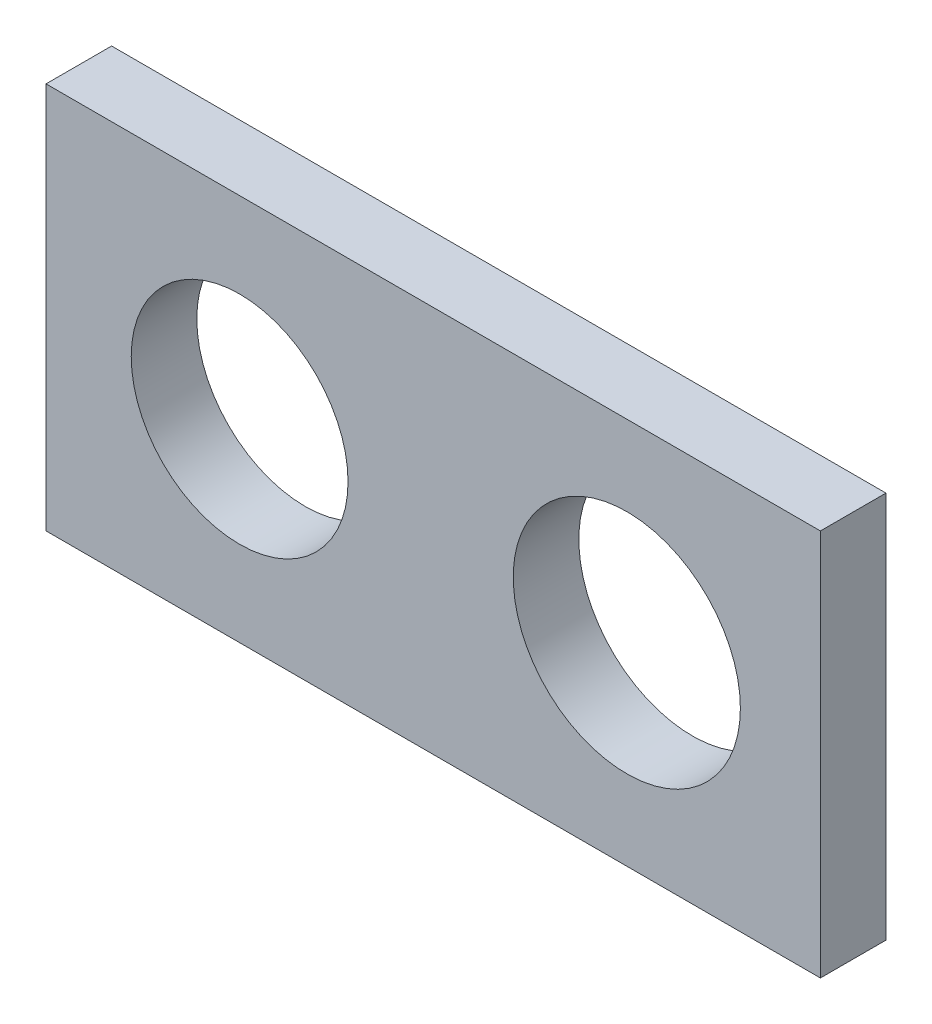
ISO-10303-21;
HEADER;
FILE_DESCRIPTION(('STEP AP214'),'2;1');
FILE_NAME('part.step','',(''),(''),'','','');
FILE_SCHEMA(('AUTOMOTIVE_DESIGN { 1 0 10303 214 1 1 1 1 }'));
ENDSEC;
DATA;
#1=APPLICATION_CONTEXT('core data for automotive mechanical design processes');
#2=APPLICATION_PROTOCOL_DEFINITION('international standard','automotive_design',2000,#1);
#3=PRODUCT_CONTEXT('',#1,'mechanical');
#4=PRODUCT('Part','Part','',(#3));
#5=PRODUCT_RELATED_PRODUCT_CATEGORY('part','',(#4));
#6=PRODUCT_DEFINITION_FORMATION('','',#4);
#7=PRODUCT_DEFINITION_CONTEXT('part definition',#1,'design');
#8=PRODUCT_DEFINITION('design','',#6,#7);
#9=PRODUCT_DEFINITION_SHAPE('','',#8);
#10=(LENGTH_UNIT() NAMED_UNIT(*) SI_UNIT(.MILLI.,.METRE.));
#11=(NAMED_UNIT(*) PLANE_ANGLE_UNIT() SI_UNIT($,.RADIAN.));
#12=(NAMED_UNIT(*) SI_UNIT($,.STERADIAN.) SOLID_ANGLE_UNIT());
#13=UNCERTAINTY_MEASURE_WITH_UNIT(LENGTH_MEASURE(1.E-05),#10,'distance_accuracy_value','');
#14=(GEOMETRIC_REPRESENTATION_CONTEXT(3) GLOBAL_UNCERTAINTY_ASSIGNED_CONTEXT((#13)) GLOBAL_UNIT_ASSIGNED_CONTEXT((#10,
#11,#12)) REPRESENTATION_CONTEXT('',''));
#15=CARTESIAN_POINT('',(0.,0.,0.));
#16=DIRECTION('',(0.,0.,1.));
#17=DIRECTION('',(1.,0.,0.));
#18=AXIS2_PLACEMENT_3D('',#15,#16,#17);
#19=CARTESIAN_POINT('',(0.,0.,2.54));
#20=DIRECTION('',(0.,0.,-1.));
#21=DIRECTION('',(-1.,0.,0.));
#22=AXIS2_PLACEMENT_3D('',#19,#20,#21);
#23=PLANE('',#22);
#24=DIRECTION('',(0.,1.,0.));
#25=VECTOR('',#24,1.);
#26=CARTESIAN_POINT('',(15.,-7.5,2.54));
#27=LINE('',#26,#25);
#28=CARTESIAN_POINT('',(15.,-7.5,2.54));
#29=VERTEX_POINT('',#28);
#30=CARTESIAN_POINT('',(15.,7.5,2.54));
#31=VERTEX_POINT('',#30);
#32=EDGE_CURVE('E91',#29,#31,#27,.T.);
#33=ORIENTED_EDGE('',*,*,#32,.T.);
#34=DIRECTION('',(-1.,0.,0.));
#35=VECTOR('',#34,1.);
#36=CARTESIAN_POINT('',(-15.,7.5,2.54));
#37=LINE('',#36,#35);
#38=CARTESIAN_POINT('',(-15.,7.5,2.54));
#39=VERTEX_POINT('',#38);
#40=EDGE_CURVE('E86',#31,#39,#37,.T.);
#41=ORIENTED_EDGE('',*,*,#40,.T.);
#42=DIRECTION('',(0.,-1.,0.));
#43=VECTOR('',#42,1.);
#44=CARTESIAN_POINT('',(-15.,-7.5,2.54));
#45=LINE('',#44,#43);
#46=CARTESIAN_POINT('',(-15.,-7.5,2.54));
#47=VERTEX_POINT('',#46);
#48=EDGE_CURVE('E89',#39,#47,#45,.T.);
#49=ORIENTED_EDGE('',*,*,#48,.T.);
#50=DIRECTION('',(1.,0.,0.));
#51=VECTOR('',#50,1.);
#52=CARTESIAN_POINT('',(-15.,-7.5,2.54));
#53=LINE('',#52,#51);
#54=EDGE_CURVE('E56',#47,#29,#53,.T.);
#55=ORIENTED_EDGE('',*,*,#54,.T.);
#56=EDGE_LOOP('',(#33,#41,#49,#55));
#57=FACE_BOUND('',#56,.T.);
#58=CARTESIAN_POINT('',(-7.5,0.,2.54));
#59=DIRECTION('',(0.,0.,1.));
#60=DIRECTION('',(1.,0.,0.));
#61=AXIS2_PLACEMENT_3D('',#58,#59,#60);
#62=CIRCLE('',#61,4.2);
#63=CARTESIAN_POINT('',(-3.3,0.,2.54));
#64=VERTEX_POINT('',#63);
#65=EDGE_CURVE('E106',#64,#64,#62,.T.);
#66=ORIENTED_EDGE('',*,*,#65,.F.);
#67=EDGE_LOOP('',(#66));
#68=FACE_BOUND('',#67,.T.);
#69=CARTESIAN_POINT('',(7.5,0.,2.54));
#70=DIRECTION('',(0.,0.,1.));
#71=DIRECTION('',(1.,0.,0.));
#72=AXIS2_PLACEMENT_3D('',#69,#70,#71);
#73=CIRCLE('',#72,4.4);
#74=CARTESIAN_POINT('',(11.9,0.,2.54));
#75=VERTEX_POINT('',#74);
#76=EDGE_CURVE('E121',#75,#75,#73,.T.);
#77=ORIENTED_EDGE('',*,*,#76,.F.);
#78=EDGE_LOOP('',(#77));
#79=FACE_BOUND('',#78,.T.);
#80=ADVANCED_FACE('F39',(#57,#68,#79),#23,.F.);
#81=CARTESIAN_POINT('',(0.,0.,0.));
#82=DIRECTION('',(0.,0.,-1.));
#83=DIRECTION('',(-1.,0.,0.));
#84=AXIS2_PLACEMENT_3D('',#81,#82,#83);
#85=PLANE('',#84);
#86=CARTESIAN_POINT('',(-7.5,0.,0.));
#87=DIRECTION('',(0.,0.,1.));
#88=DIRECTION('',(1.,0.,0.));
#89=AXIS2_PLACEMENT_3D('',#86,#87,#88);
#90=CIRCLE('',#89,4.2);
#91=CARTESIAN_POINT('',(-3.3,0.,0.));
#92=VERTEX_POINT('',#91);
#93=EDGE_CURVE('E118',#92,#92,#90,.T.);
#94=ORIENTED_EDGE('',*,*,#93,.T.);
#95=EDGE_LOOP('',(#94));
#96=FACE_BOUND('',#95,.T.);
#97=DIRECTION('',(0.,1.,0.));
#98=VECTOR('',#97,1.);
#99=CARTESIAN_POINT('',(15.,-7.5,0.));
#100=LINE('',#99,#98);
#101=CARTESIAN_POINT('',(15.,-7.5,0.));
#102=VERTEX_POINT('',#101);
#103=CARTESIAN_POINT('',(15.,7.5,0.));
#104=VERTEX_POINT('',#103);
#105=EDGE_CURVE('E103',#102,#104,#100,.T.);
#106=ORIENTED_EDGE('',*,*,#105,.F.);
#107=DIRECTION('',(1.,0.,0.));
#108=VECTOR('',#107,1.);
#109=CARTESIAN_POINT('',(-15.,-7.5,0.));
#110=LINE('',#109,#108);
#111=CARTESIAN_POINT('',(-15.,-7.5,0.));
#112=VERTEX_POINT('',#111);
#113=EDGE_CURVE('E79',#112,#102,#110,.T.);
#114=ORIENTED_EDGE('',*,*,#113,.F.);
#115=DIRECTION('',(0.,-1.,0.));
#116=VECTOR('',#115,1.);
#117=CARTESIAN_POINT('',(-15.,-7.5,0.));
#118=LINE('',#117,#116);
#119=CARTESIAN_POINT('',(-15.,7.5,0.));
#120=VERTEX_POINT('',#119);
#121=EDGE_CURVE('E73',#120,#112,#118,.T.);
#122=ORIENTED_EDGE('',*,*,#121,.F.);
#123=DIRECTION('',(-1.,0.,0.));
#124=VECTOR('',#123,1.);
#125=CARTESIAN_POINT('',(-15.,7.5,0.));
#126=LINE('',#125,#124);
#127=EDGE_CURVE('E95',#104,#120,#126,.T.);
#128=ORIENTED_EDGE('',*,*,#127,.F.);
#129=EDGE_LOOP('',(#106,#114,#122,#128));
#130=FACE_BOUND('',#129,.T.);
#131=CARTESIAN_POINT('',(7.5,0.,0.));
#132=DIRECTION('',(0.,0.,1.));
#133=DIRECTION('',(1.,0.,0.));
#134=AXIS2_PLACEMENT_3D('',#131,#132,#133);
#135=CIRCLE('',#134,4.4);
#136=CARTESIAN_POINT('',(11.9,0.,0.));
#137=VERTEX_POINT('',#136);
#138=EDGE_CURVE('E124',#137,#137,#135,.T.);
#139=ORIENTED_EDGE('',*,*,#138,.T.);
#140=EDGE_LOOP('',(#139));
#141=FACE_BOUND('',#140,.T.);
#142=ADVANCED_FACE('F114',(#96,#130,#141),#85,.T.);
#143=CARTESIAN_POINT('',(15.,-7.5,2.54));
#144=DIRECTION('',(-1.,0.,0.));
#145=DIRECTION('',(0.,0.,1.));
#146=AXIS2_PLACEMENT_3D('',#143,#144,#145);
#147=PLANE('',#146);
#148=ORIENTED_EDGE('',*,*,#105,.T.);
#149=DIRECTION('',(0.,0.,-1.));
#150=VECTOR('',#149,1.);
#151=CARTESIAN_POINT('',(15.,7.5,2.54));
#152=LINE('',#151,#150);
#153=EDGE_CURVE('E11',#31,#104,#152,.T.);
#154=ORIENTED_EDGE('',*,*,#153,.F.);
#155=ORIENTED_EDGE('',*,*,#32,.F.);
#156=DIRECTION('',(0.,0.,-1.));
#157=VECTOR('',#156,1.);
#158=CARTESIAN_POINT('',(15.,-7.5,2.54));
#159=LINE('',#158,#157);
#160=EDGE_CURVE('E99',#29,#102,#159,.T.);
#161=ORIENTED_EDGE('',*,*,#160,.T.);
#162=EDGE_LOOP('',(#148,#154,#155,#161));
#163=FACE_BOUND('',#162,.T.);
#164=ADVANCED_FACE('F41',(#163),#147,.F.);
#165=CARTESIAN_POINT('',(-15.,7.5,2.54));
#166=DIRECTION('',(0.,-1.,0.));
#167=DIRECTION('',(0.,0.,-1.));
#168=AXIS2_PLACEMENT_3D('',#165,#166,#167);
#169=PLANE('',#168);
#170=ORIENTED_EDGE('',*,*,#127,.T.);
#171=DIRECTION('',(0.,0.,-1.));
#172=VECTOR('',#171,1.);
#173=CARTESIAN_POINT('',(-15.,7.5,2.54));
#174=LINE('',#173,#172);
#175=EDGE_CURVE('E48',#39,#120,#174,.T.);
#176=ORIENTED_EDGE('',*,*,#175,.F.);
#177=ORIENTED_EDGE('',*,*,#40,.F.);
#178=ORIENTED_EDGE('',*,*,#153,.T.);
#179=EDGE_LOOP('',(#170,#176,#177,#178));
#180=FACE_BOUND('',#179,.T.);
#181=ADVANCED_FACE('F94',(#180),#169,.F.);
#182=CARTESIAN_POINT('',(-15.,-7.5,2.54));
#183=DIRECTION('',(1.,0.,0.));
#184=DIRECTION('',(0.,0.,-1.));
#185=AXIS2_PLACEMENT_3D('',#182,#183,#184);
#186=PLANE('',#185);
#187=ORIENTED_EDGE('',*,*,#121,.T.);
#188=DIRECTION('',(0.,0.,-1.));
#189=VECTOR('',#188,1.);
#190=CARTESIAN_POINT('',(-15.,-7.5,2.54));
#191=LINE('',#190,#189);
#192=EDGE_CURVE('E96',#47,#112,#191,.T.);
#193=ORIENTED_EDGE('',*,*,#192,.F.);
#194=ORIENTED_EDGE('',*,*,#48,.F.);
#195=ORIENTED_EDGE('',*,*,#175,.T.);
#196=EDGE_LOOP('',(#187,#193,#194,#195));
#197=FACE_BOUND('',#196,.T.);
#198=ADVANCED_FACE('F97',(#197),#186,.F.);
#199=CARTESIAN_POINT('',(-15.,-7.5,2.54));
#200=DIRECTION('',(0.,1.,0.));
#201=DIRECTION('',(0.,0.,1.));
#202=AXIS2_PLACEMENT_3D('',#199,#200,#201);
#203=PLANE('',#202);
#204=ORIENTED_EDGE('',*,*,#113,.T.);
#205=ORIENTED_EDGE('',*,*,#160,.F.);
#206=ORIENTED_EDGE('',*,*,#54,.F.);
#207=ORIENTED_EDGE('',*,*,#192,.T.);
#208=EDGE_LOOP('',(#204,#205,#206,#207));
#209=FACE_BOUND('',#208,.T.);
#210=ADVANCED_FACE('F111',(#209),#203,.F.);
#211=CARTESIAN_POINT('',(-7.5,0.,2.54));
#212=DIRECTION('',(0.,0.,-1.));
#213=DIRECTION('',(-1.,0.,0.));
#214=AXIS2_PLACEMENT_3D('',#211,#212,#213);
#215=CYLINDRICAL_SURFACE('',#214,4.2);
#216=ORIENTED_EDGE('',*,*,#65,.T.);
#217=EDGE_LOOP('',(#216));
#218=FACE_BOUND('',#217,.T.);
#219=ORIENTED_EDGE('',*,*,#93,.F.);
#220=EDGE_LOOP('',(#219));
#221=FACE_BOUND('',#220,.T.);
#222=ADVANCED_FACE('F141',(#218,#221),#215,.F.);
#223=CARTESIAN_POINT('',(7.5,0.,2.54));
#224=DIRECTION('',(0.,0.,-1.));
#225=DIRECTION('',(-1.,0.,0.));
#226=AXIS2_PLACEMENT_3D('',#223,#224,#225);
#227=CYLINDRICAL_SURFACE('',#226,4.4);
#228=ORIENTED_EDGE('',*,*,#76,.T.);
#229=EDGE_LOOP('',(#228));
#230=FACE_BOUND('',#229,.T.);
#231=ORIENTED_EDGE('',*,*,#138,.F.);
#232=EDGE_LOOP('',(#231));
#233=FACE_BOUND('',#232,.T.);
#234=ADVANCED_FACE('F130',(#230,#233),#227,.F.);
#235=CLOSED_SHELL('',(#80,#142,#164,#181,#198,#210,#222,#234));
#236=MANIFOLD_SOLID_BREP('B2',#235);
#237=ADVANCED_BREP_SHAPE_REPRESENTATION('',(#18,#236),#14);
#238=SHAPE_DEFINITION_REPRESENTATION(#9,#237);
ENDSEC;
END-ISO-10303-21;
